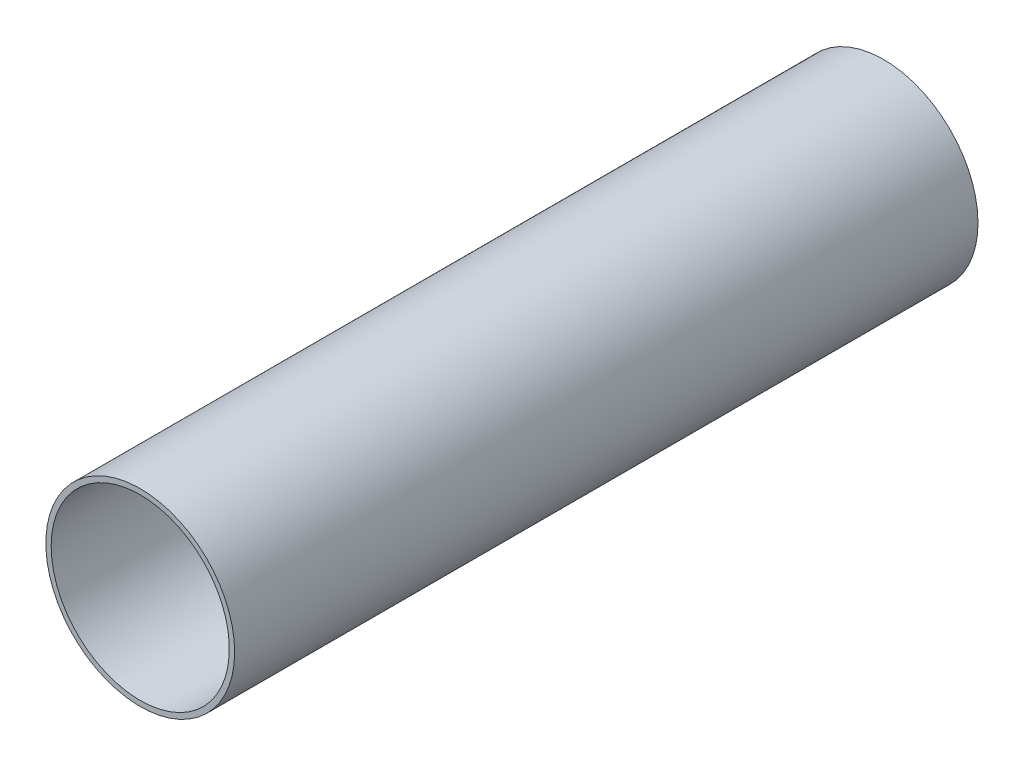
ISO-10303-21;
HEADER;
FILE_DESCRIPTION(('STEP AP214'),'2;1');
FILE_NAME('part.step','',(''),(''),'','','');
FILE_SCHEMA(('AUTOMOTIVE_DESIGN { 1 0 10303 214 1 1 1 1 }'));
ENDSEC;
DATA;
#1=APPLICATION_CONTEXT('core data for automotive mechanical design processes');
#2=APPLICATION_PROTOCOL_DEFINITION('international standard','automotive_design',2000,#1);
#3=PRODUCT_CONTEXT('',#1,'mechanical');
#4=PRODUCT('Part','Part','',(#3));
#5=PRODUCT_RELATED_PRODUCT_CATEGORY('part','',(#4));
#6=PRODUCT_DEFINITION_FORMATION('','',#4);
#7=PRODUCT_DEFINITION_CONTEXT('part definition',#1,'design');
#8=PRODUCT_DEFINITION('design','',#6,#7);
#9=PRODUCT_DEFINITION_SHAPE('','',#8);
#10=(LENGTH_UNIT() NAMED_UNIT(*) SI_UNIT(.MILLI.,.METRE.));
#11=(NAMED_UNIT(*) PLANE_ANGLE_UNIT() SI_UNIT($,.RADIAN.));
#12=(NAMED_UNIT(*) SI_UNIT($,.STERADIAN.) SOLID_ANGLE_UNIT());
#13=UNCERTAINTY_MEASURE_WITH_UNIT(LENGTH_MEASURE(1.E-05),#10,'distance_accuracy_value','');
#14=(GEOMETRIC_REPRESENTATION_CONTEXT(3) GLOBAL_UNCERTAINTY_ASSIGNED_CONTEXT((#13)) GLOBAL_UNIT_ASSIGNED_CONTEXT((#10,
#11,#12)) REPRESENTATION_CONTEXT('',''));
#15=CARTESIAN_POINT('',(0.,0.,0.));
#16=DIRECTION('',(0.,0.,1.));
#17=DIRECTION('',(1.,0.,0.));
#18=AXIS2_PLACEMENT_3D('',#15,#16,#17);
#19=CARTESIAN_POINT('',(0.,0.,150.));
#20=DIRECTION('',(0.,0.,-1.));
#21=DIRECTION('',(-1.,0.,0.));
#22=AXIS2_PLACEMENT_3D('',#19,#20,#21);
#23=CYLINDRICAL_SURFACE('',#22,19.05);
#24=CARTESIAN_POINT('',(0.,0.,150.));
#25=DIRECTION('',(0.,0.,1.));
#26=DIRECTION('',(1.,0.,0.));
#27=AXIS2_PLACEMENT_3D('',#24,#25,#26);
#28=CIRCLE('',#27,19.05);
#29=CARTESIAN_POINT('',(19.05,0.,150.));
#30=VERTEX_POINT('',#29);
#31=EDGE_CURVE('E10',#30,#30,#28,.T.);
#32=ORIENTED_EDGE('',*,*,#31,.F.);
#33=EDGE_LOOP('',(#32));
#34=FACE_BOUND('',#33,.T.);
#35=CARTESIAN_POINT('',(0.,0.,0.));
#36=DIRECTION('',(0.,0.,1.));
#37=DIRECTION('',(1.,0.,0.));
#38=AXIS2_PLACEMENT_3D('',#35,#36,#37);
#39=CIRCLE('',#38,19.05);
#40=CARTESIAN_POINT('',(19.05,0.,0.));
#41=VERTEX_POINT('',#40);
#42=EDGE_CURVE('E34',#41,#41,#39,.T.);
#43=ORIENTED_EDGE('',*,*,#42,.T.);
#44=EDGE_LOOP('',(#43));
#45=FACE_BOUND('',#44,.T.);
#46=ADVANCED_FACE('F31',(#34,#45),#23,.T.);
#47=CARTESIAN_POINT('',(0.,0.,150.));
#48=DIRECTION('',(0.,0.,1.));
#49=DIRECTION('',(1.,0.,0.));
#50=AXIS2_PLACEMENT_3D('',#47,#48,#49);
#51=PLANE('',#50);
#52=CARTESIAN_POINT('',(0.,0.,150.));
#53=DIRECTION('',(0.,0.,-1.));
#54=DIRECTION('',(-1.,0.,0.));
#55=AXIS2_PLACEMENT_3D('',#52,#53,#54);
#56=CIRCLE('',#55,17.9788625003141);
#57=CARTESIAN_POINT('',(-17.9788625003141,0.,150.));
#58=VERTEX_POINT('',#57);
#59=EDGE_CURVE('E41',#58,#58,#56,.T.);
#60=ORIENTED_EDGE('',*,*,#59,.T.);
#61=EDGE_LOOP('',(#60));
#62=FACE_BOUND('',#61,.T.);
#63=ORIENTED_EDGE('',*,*,#31,.T.);
#64=EDGE_LOOP('',(#63));
#65=FACE_BOUND('',#64,.T.);
#66=ADVANCED_FACE('F49',(#62,#65),#51,.T.);
#67=CARTESIAN_POINT('',(0.,0.,0.));
#68=DIRECTION('',(0.,0.,1.));
#69=DIRECTION('',(1.,0.,0.));
#70=AXIS2_PLACEMENT_3D('',#67,#68,#69);
#71=PLANE('',#70);
#72=CARTESIAN_POINT('',(0.,0.,0.));
#73=DIRECTION('',(0.,0.,-1.));
#74=DIRECTION('',(-1.,0.,0.));
#75=AXIS2_PLACEMENT_3D('',#72,#73,#74);
#76=CIRCLE('',#75,17.9788625003141);
#77=CARTESIAN_POINT('',(-17.9788625003141,0.,0.));
#78=VERTEX_POINT('',#77);
#79=EDGE_CURVE('E43',#78,#78,#76,.T.);
#80=ORIENTED_EDGE('',*,*,#79,.F.);
#81=EDGE_LOOP('',(#80));
#82=FACE_BOUND('',#81,.T.);
#83=ORIENTED_EDGE('',*,*,#42,.F.);
#84=EDGE_LOOP('',(#83));
#85=FACE_BOUND('',#84,.T.);
#86=ADVANCED_FACE('F54',(#82,#85),#71,.F.);
#87=CARTESIAN_POINT('',(0.,0.,150.));
#88=DIRECTION('',(0.,0.,-1.));
#89=DIRECTION('',(-1.,0.,0.));
#90=AXIS2_PLACEMENT_3D('',#87,#88,#89);
#91=CYLINDRICAL_SURFACE('',#90,17.9788625003141);
#92=ORIENTED_EDGE('',*,*,#59,.F.);
#93=EDGE_LOOP('',(#92));
#94=FACE_BOUND('',#93,.T.);
#95=ORIENTED_EDGE('',*,*,#79,.T.);
#96=EDGE_LOOP('',(#95));
#97=FACE_BOUND('',#96,.T.);
#98=ADVANCED_FACE('F51',(#94,#97),#91,.F.);
#99=CLOSED_SHELL('',(#46,#66,#86,#98));
#100=MANIFOLD_SOLID_BREP('B2',#99);
#101=ADVANCED_BREP_SHAPE_REPRESENTATION('',(#18,#100),#14);
#102=SHAPE_DEFINITION_REPRESENTATION(#9,#101);
ENDSEC;
END-ISO-10303-21;
